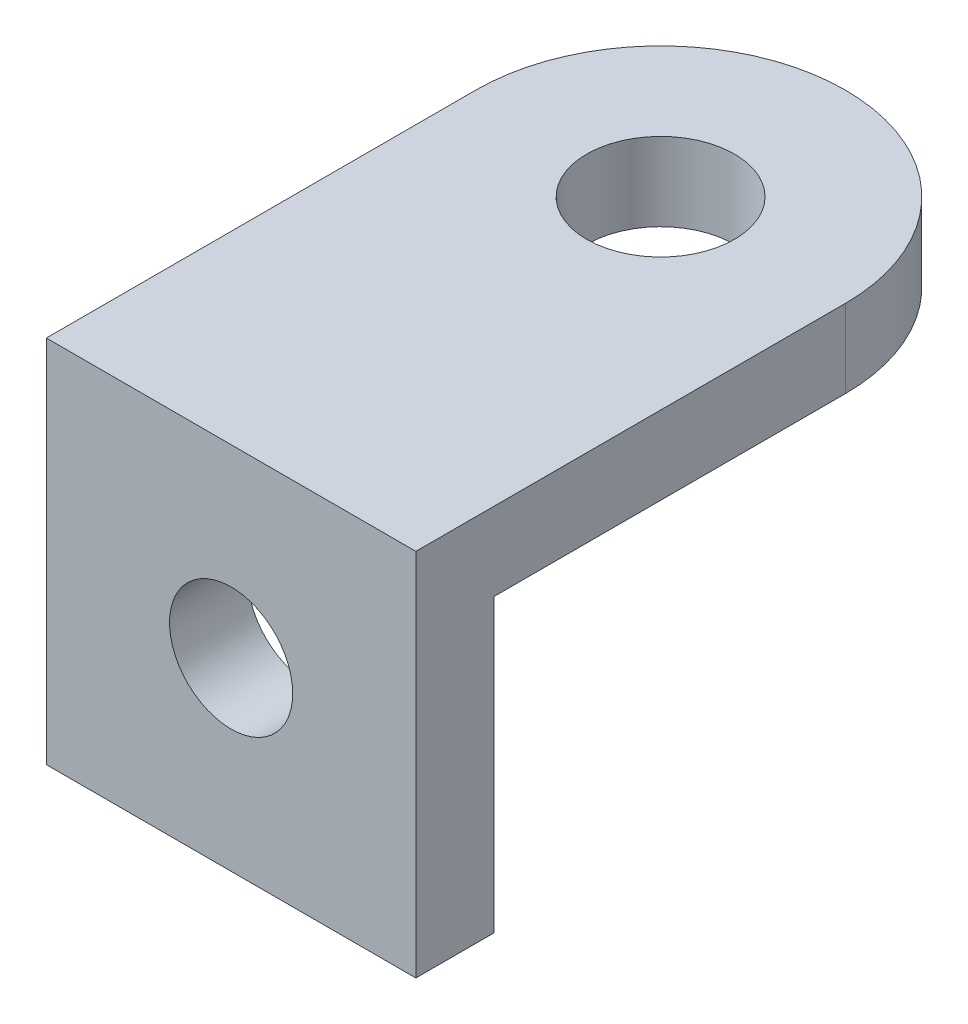
ISO-10303-21;
HEADER;
FILE_DESCRIPTION(('STEP AP214'),'2;1');
FILE_NAME('part.step','',(''),(''),'','','');
FILE_SCHEMA(('AUTOMOTIVE_DESIGN { 1 0 10303 214 1 1 1 1 }'));
ENDSEC;
DATA;
#1=APPLICATION_CONTEXT('core data for automotive mechanical design processes');
#2=APPLICATION_PROTOCOL_DEFINITION('international standard','automotive_design',2000,#1);
#3=PRODUCT_CONTEXT('',#1,'mechanical');
#4=PRODUCT('Part','Part','',(#3));
#5=PRODUCT_RELATED_PRODUCT_CATEGORY('part','',(#4));
#6=PRODUCT_DEFINITION_FORMATION('','',#4);
#7=PRODUCT_DEFINITION_CONTEXT('part definition',#1,'design');
#8=PRODUCT_DEFINITION('design','',#6,#7);
#9=PRODUCT_DEFINITION_SHAPE('','',#8);
#10=(LENGTH_UNIT() NAMED_UNIT(*) SI_UNIT(.MILLI.,.METRE.));
#11=(NAMED_UNIT(*) PLANE_ANGLE_UNIT() SI_UNIT($,.RADIAN.));
#12=(NAMED_UNIT(*) SI_UNIT($,.STERADIAN.) SOLID_ANGLE_UNIT());
#13=UNCERTAINTY_MEASURE_WITH_UNIT(LENGTH_MEASURE(1.E-05),#10,'distance_accuracy_value','');
#14=(GEOMETRIC_REPRESENTATION_CONTEXT(3) GLOBAL_UNCERTAINTY_ASSIGNED_CONTEXT((#13)) GLOBAL_UNIT_ASSIGNED_CONTEXT((#10,
#11,#12)) REPRESENTATION_CONTEXT('',''));
#15=CARTESIAN_POINT('',(0.,0.,0.));
#16=DIRECTION('',(0.,0.,1.));
#17=DIRECTION('',(1.,0.,0.));
#18=AXIS2_PLACEMENT_3D('',#15,#16,#17);
#19=CARTESIAN_POINT('',(0.,0.,3.175));
#20=DIRECTION('',(0.,0.,1.));
#21=DIRECTION('',(1.,0.,0.));
#22=AXIS2_PLACEMENT_3D('',#19,#20,#21);
#23=PLANE('',#22);
#24=DIRECTION('',(0.,1.,0.));
#25=VECTOR('',#24,1.);
#26=CARTESIAN_POINT('',(7.5,0.,3.175));
#27=LINE('',#26,#25);
#28=CARTESIAN_POINT('',(7.5,-15.,3.175));
#29=VERTEX_POINT('',#28);
#30=CARTESIAN_POINT('',(7.5,0.,3.175));
#31=VERTEX_POINT('',#30);
#32=EDGE_CURVE('E133',#29,#31,#27,.T.);
#33=ORIENTED_EDGE('',*,*,#32,.T.);
#34=DIRECTION('',(-1.,0.,0.));
#35=VECTOR('',#34,1.);
#36=CARTESIAN_POINT('',(-7.5,0.,3.175));
#37=LINE('',#36,#35);
#38=CARTESIAN_POINT('',(-7.5,0.,3.175));
#39=VERTEX_POINT('',#38);
#40=EDGE_CURVE('E81',#31,#39,#37,.T.);
#41=ORIENTED_EDGE('',*,*,#40,.T.);
#42=DIRECTION('',(0.,-1.,0.));
#43=VECTOR('',#42,1.);
#44=CARTESIAN_POINT('',(-7.5,0.,3.175));
#45=LINE('',#44,#43);
#46=CARTESIAN_POINT('',(-7.5,-15.,3.175));
#47=VERTEX_POINT('',#46);
#48=EDGE_CURVE('E136',#39,#47,#45,.T.);
#49=ORIENTED_EDGE('',*,*,#48,.T.);
#50=DIRECTION('',(1.,0.,0.));
#51=VECTOR('',#50,1.);
#52=CARTESIAN_POINT('',(-7.5,-15.,3.175));
#53=LINE('',#52,#51);
#54=EDGE_CURVE('E59',#47,#29,#53,.T.);
#55=ORIENTED_EDGE('',*,*,#54,.T.);
#56=EDGE_LOOP('',(#33,#41,#49,#55));
#57=FACE_BOUND('',#56,.T.);
#58=CARTESIAN_POINT('',(0.,-7.5,3.175));
#59=DIRECTION('',(0.,0.,1.));
#60=DIRECTION('',(1.,0.,0.));
#61=AXIS2_PLACEMENT_3D('',#58,#59,#60);
#62=CIRCLE('',#61,2.5);
#63=CARTESIAN_POINT('',(2.5,-7.5,3.175));
#64=VERTEX_POINT('',#63);
#65=EDGE_CURVE('E128',#64,#64,#62,.T.);
#66=ORIENTED_EDGE('',*,*,#65,.F.);
#67=EDGE_LOOP('',(#66));
#68=FACE_BOUND('',#67,.T.);
#69=ADVANCED_FACE('F35',(#57,#68),#23,.T.);
#70=CARTESIAN_POINT('',(0.,0.,0.));
#71=DIRECTION('',(0.,0.,1.));
#72=DIRECTION('',(1.,0.,0.));
#73=AXIS2_PLACEMENT_3D('',#70,#71,#72);
#74=PLANE('',#73);
#75=DIRECTION('',(0.,-1.,0.));
#76=VECTOR('',#75,1.);
#77=CARTESIAN_POINT('',(-7.5,0.,0.));
#78=LINE('',#77,#76);
#79=CARTESIAN_POINT('',(-7.5,-3.175,0.));
#80=VERTEX_POINT('',#79);
#81=CARTESIAN_POINT('',(-7.5,-15.,0.));
#82=VERTEX_POINT('',#81);
#83=EDGE_CURVE('E141',#80,#82,#78,.T.);
#84=ORIENTED_EDGE('',*,*,#83,.F.);
#85=DIRECTION('',(1.,0.,0.));
#86=VECTOR('',#85,1.);
#87=CARTESIAN_POINT('',(-7.5,-3.175,0.));
#88=LINE('',#87,#86);
#89=CARTESIAN_POINT('',(7.5,-3.175,0.));
#90=VERTEX_POINT('',#89);
#91=EDGE_CURVE('E108',#80,#90,#88,.T.);
#92=ORIENTED_EDGE('',*,*,#91,.T.);
#93=DIRECTION('',(0.,1.,0.));
#94=VECTOR('',#93,1.);
#95=CARTESIAN_POINT('',(7.5,0.,0.));
#96=LINE('',#95,#94);
#97=CARTESIAN_POINT('',(7.5,-15.,0.));
#98=VERTEX_POINT('',#97);
#99=EDGE_CURVE('E116',#98,#90,#96,.T.);
#100=ORIENTED_EDGE('',*,*,#99,.F.);
#101=DIRECTION('',(1.,0.,0.));
#102=VECTOR('',#101,1.);
#103=CARTESIAN_POINT('',(-7.5,-15.,0.));
#104=LINE('',#103,#102);
#105=EDGE_CURVE('E74',#82,#98,#104,.T.);
#106=ORIENTED_EDGE('',*,*,#105,.F.);
#107=EDGE_LOOP('',(#84,#92,#100,#106));
#108=FACE_BOUND('',#107,.T.);
#109=CARTESIAN_POINT('',(0.,-7.5,0.));
#110=DIRECTION('',(0.,0.,1.));
#111=DIRECTION('',(1.,0.,0.));
#112=AXIS2_PLACEMENT_3D('',#109,#110,#111);
#113=CIRCLE('',#112,2.5);
#114=CARTESIAN_POINT('',(2.5,-7.5,0.));
#115=VERTEX_POINT('',#114);
#116=EDGE_CURVE('E126',#115,#115,#113,.T.);
#117=ORIENTED_EDGE('',*,*,#116,.T.);
#118=EDGE_LOOP('',(#117));
#119=FACE_BOUND('',#118,.T.);
#120=ADVANCED_FACE('F168',(#108,#119),#74,.F.);
#121=CARTESIAN_POINT('',(7.5,0.,3.175));
#122=DIRECTION('',(-1.,0.,0.));
#123=DIRECTION('',(0.,0.,1.));
#124=AXIS2_PLACEMENT_3D('',#121,#122,#123);
#125=PLANE('',#124);
#126=ORIENTED_EDGE('',*,*,#99,.T.);
#127=DIRECTION('',(0.,0.,-1.));
#128=VECTOR('',#127,1.);
#129=CARTESIAN_POINT('',(7.5,-3.175,0.));
#130=LINE('',#129,#128);
#131=CARTESIAN_POINT('',(7.5,-3.175,-14.26));
#132=VERTEX_POINT('',#131);
#133=EDGE_CURVE('E50',#90,#132,#130,.T.);
#134=ORIENTED_EDGE('',*,*,#133,.T.);
#135=DIRECTION('',(0.,1.,0.));
#136=VECTOR('',#135,1.);
#137=CARTESIAN_POINT('',(7.5,-3.175,-14.26));
#138=LINE('',#137,#136);
#139=CARTESIAN_POINT('',(7.5,0.,-14.26));
#140=VERTEX_POINT('',#139);
#141=EDGE_CURVE('E99',#132,#140,#138,.T.);
#142=ORIENTED_EDGE('',*,*,#141,.T.);
#143=DIRECTION('',(0.,0.,-1.));
#144=VECTOR('',#143,1.);
#145=CARTESIAN_POINT('',(7.5,0.,3.175));
#146=LINE('',#145,#144);
#147=EDGE_CURVE('E11',#31,#140,#146,.T.);
#148=ORIENTED_EDGE('',*,*,#147,.F.);
#149=ORIENTED_EDGE('',*,*,#32,.F.);
#150=DIRECTION('',(0.,0.,-1.));
#151=VECTOR('',#150,1.);
#152=CARTESIAN_POINT('',(7.5,-15.,3.175));
#153=LINE('',#152,#151);
#154=EDGE_CURVE('E139',#29,#98,#153,.T.);
#155=ORIENTED_EDGE('',*,*,#154,.T.);
#156=EDGE_LOOP('',(#126,#134,#142,#148,#149,#155));
#157=FACE_BOUND('',#156,.T.);
#158=ADVANCED_FACE('F37',(#157),#125,.F.);
#159=CARTESIAN_POINT('',(-7.5,0.,3.175));
#160=DIRECTION('',(0.,-1.,0.));
#161=DIRECTION('',(0.,0.,-1.));
#162=AXIS2_PLACEMENT_3D('',#159,#160,#161);
#163=PLANE('',#162);
#164=ORIENTED_EDGE('',*,*,#147,.T.);
#165=CARTESIAN_POINT('',(0.,0.,-14.26));
#166=DIRECTION('',(0.,1.,0.));
#167=DIRECTION('',(0.,0.,1.));
#168=AXIS2_PLACEMENT_3D('',#165,#166,#167);
#169=CIRCLE('',#168,7.5);
#170=CARTESIAN_POINT('',(-7.5,0.,-14.26));
#171=VERTEX_POINT('',#170);
#172=EDGE_CURVE('E104',#140,#171,#169,.T.);
#173=ORIENTED_EDGE('',*,*,#172,.T.);
#174=DIRECTION('',(0.,0.,-1.));
#175=VECTOR('',#174,1.);
#176=CARTESIAN_POINT('',(-7.5,0.,3.175));
#177=LINE('',#176,#175);
#178=EDGE_CURVE('E43',#39,#171,#177,.T.);
#179=ORIENTED_EDGE('',*,*,#178,.F.);
#180=ORIENTED_EDGE('',*,*,#40,.F.);
#181=EDGE_LOOP('',(#164,#173,#179,#180));
#182=FACE_BOUND('',#181,.T.);
#183=CARTESIAN_POINT('',(0.,0.,-14.26));
#184=DIRECTION('',(0.,1.,0.));
#185=DIRECTION('',(0.,0.,1.));
#186=AXIS2_PLACEMENT_3D('',#183,#184,#185);
#187=CIRCLE('',#186,3.);
#188=CARTESIAN_POINT('',(0.,0.,-11.26));
#189=VERTEX_POINT('',#188);
#190=EDGE_CURVE('E121',#189,#189,#187,.T.);
#191=ORIENTED_EDGE('',*,*,#190,.F.);
#192=EDGE_LOOP('',(#191));
#193=FACE_BOUND('',#192,.T.);
#194=ADVANCED_FACE('F150',(#182,#193),#163,.F.);
#195=CARTESIAN_POINT('',(-7.5,0.,3.175));
#196=DIRECTION('',(1.,0.,0.));
#197=DIRECTION('',(0.,1.,0.));
#198=AXIS2_PLACEMENT_3D('',#195,#196,#197);
#199=PLANE('',#198);
#200=ORIENTED_EDGE('',*,*,#178,.T.);
#201=DIRECTION('',(0.,1.,0.));
#202=VECTOR('',#201,1.);
#203=CARTESIAN_POINT('',(-7.5,-3.175,-14.26));
#204=LINE('',#203,#202);
#205=CARTESIAN_POINT('',(-7.5,-3.175,-14.26));
#206=VERTEX_POINT('',#205);
#207=EDGE_CURVE('E107',#206,#171,#204,.T.);
#208=ORIENTED_EDGE('',*,*,#207,.F.);
#209=DIRECTION('',(0.,0.,1.));
#210=VECTOR('',#209,1.);
#211=CARTESIAN_POINT('',(-7.5,-3.175,-14.26));
#212=LINE('',#211,#210);
#213=EDGE_CURVE('E112',#206,#80,#212,.T.);
#214=ORIENTED_EDGE('',*,*,#213,.T.);
#215=ORIENTED_EDGE('',*,*,#83,.T.);
#216=DIRECTION('',(0.,0.,-1.));
#217=VECTOR('',#216,1.);
#218=CARTESIAN_POINT('',(-7.5,-15.,3.175));
#219=LINE('',#218,#217);
#220=EDGE_CURVE('E145',#47,#82,#219,.T.);
#221=ORIENTED_EDGE('',*,*,#220,.F.);
#222=ORIENTED_EDGE('',*,*,#48,.F.);
#223=EDGE_LOOP('',(#200,#208,#214,#215,#221,#222));
#224=FACE_BOUND('',#223,.T.);
#225=ADVANCED_FACE('F148',(#224),#199,.F.);
#226=CARTESIAN_POINT('',(-7.5,-15.,3.175));
#227=DIRECTION('',(0.,1.,0.));
#228=DIRECTION('',(-1.,0.,0.));
#229=AXIS2_PLACEMENT_3D('',#226,#227,#228);
#230=PLANE('',#229);
#231=ORIENTED_EDGE('',*,*,#105,.T.);
#232=ORIENTED_EDGE('',*,*,#154,.F.);
#233=ORIENTED_EDGE('',*,*,#54,.F.);
#234=ORIENTED_EDGE('',*,*,#220,.T.);
#235=EDGE_LOOP('',(#231,#232,#233,#234));
#236=FACE_BOUND('',#235,.T.);
#237=ADVANCED_FACE('F155',(#236),#230,.F.);
#238=CARTESIAN_POINT('',(0.,-7.5,3.175));
#239=DIRECTION('',(0.,0.,-1.));
#240=DIRECTION('',(-1.,0.,0.));
#241=AXIS2_PLACEMENT_3D('',#238,#239,#240);
#242=CYLINDRICAL_SURFACE('',#241,2.5);
#243=ORIENTED_EDGE('',*,*,#65,.T.);
#244=EDGE_LOOP('',(#243));
#245=FACE_BOUND('',#244,.T.);
#246=ORIENTED_EDGE('',*,*,#116,.F.);
#247=EDGE_LOOP('',(#246));
#248=FACE_BOUND('',#247,.T.);
#249=ADVANCED_FACE('F157',(#245,#248),#242,.F.);
#250=CARTESIAN_POINT('',(0.,-3.175,-14.26));
#251=DIRECTION('',(0.,1.,0.));
#252=DIRECTION('',(0.,0.,1.));
#253=AXIS2_PLACEMENT_3D('',#250,#251,#252);
#254=CYLINDRICAL_SURFACE('',#253,7.5);
#255=ORIENTED_EDGE('',*,*,#172,.F.);
#256=ORIENTED_EDGE('',*,*,#141,.F.);
#257=CARTESIAN_POINT('',(0.,-3.175,-14.26));
#258=DIRECTION('',(0.,1.,0.));
#259=DIRECTION('',(0.,0.,1.));
#260=AXIS2_PLACEMENT_3D('',#257,#258,#259);
#261=CIRCLE('',#260,7.5);
#262=EDGE_CURVE('E102',#132,#206,#261,.T.);
#263=ORIENTED_EDGE('',*,*,#262,.T.);
#264=ORIENTED_EDGE('',*,*,#207,.T.);
#265=EDGE_LOOP('',(#255,#256,#263,#264));
#266=FACE_BOUND('',#265,.T.);
#267=ADVANCED_FACE('F100',(#266),#254,.T.);
#268=CARTESIAN_POINT('',(0.,-3.175,-14.26));
#269=DIRECTION('',(0.,1.,0.));
#270=DIRECTION('',(0.,0.,1.));
#271=AXIS2_PLACEMENT_3D('',#268,#269,#270);
#272=PLANE('',#271);
#273=CARTESIAN_POINT('',(0.,-3.175,-14.26));
#274=DIRECTION('',(0.,1.,0.));
#275=DIRECTION('',(0.,0.,1.));
#276=AXIS2_PLACEMENT_3D('',#273,#274,#275);
#277=CIRCLE('',#276,3.);
#278=CARTESIAN_POINT('',(0.,-3.175,-11.26));
#279=VERTEX_POINT('',#278);
#280=EDGE_CURVE('E118',#279,#279,#277,.T.);
#281=ORIENTED_EDGE('',*,*,#280,.T.);
#282=EDGE_LOOP('',(#281));
#283=FACE_BOUND('',#282,.T.);
#284=ORIENTED_EDGE('',*,*,#133,.F.);
#285=ORIENTED_EDGE('',*,*,#91,.F.);
#286=ORIENTED_EDGE('',*,*,#213,.F.);
#287=ORIENTED_EDGE('',*,*,#262,.F.);
#288=EDGE_LOOP('',(#284,#285,#286,#287));
#289=FACE_BOUND('',#288,.T.);
#290=ADVANCED_FACE('F111',(#283,#289),#272,.F.);
#291=CARTESIAN_POINT('',(0.,-3.175,-14.26));
#292=DIRECTION('',(0.,1.,0.));
#293=DIRECTION('',(0.,0.,1.));
#294=AXIS2_PLACEMENT_3D('',#291,#292,#293);
#295=CYLINDRICAL_SURFACE('',#294,3.);
#296=ORIENTED_EDGE('',*,*,#280,.F.);
#297=EDGE_LOOP('',(#296));
#298=FACE_BOUND('',#297,.T.);
#299=ORIENTED_EDGE('',*,*,#190,.T.);
#300=EDGE_LOOP('',(#299));
#301=FACE_BOUND('',#300,.T.);
#302=ADVANCED_FACE('F179',(#298,#301),#295,.F.);
#303=CLOSED_SHELL('',(#69,#120,#158,#194,#225,#237,#249,#267,#290,#302));
#304=MANIFOLD_SOLID_BREP('B2',#303);
#305=ADVANCED_BREP_SHAPE_REPRESENTATION('',(#18,#304),#14);
#306=SHAPE_DEFINITION_REPRESENTATION(#9,#305);
ENDSEC;
END-ISO-10303-21;
